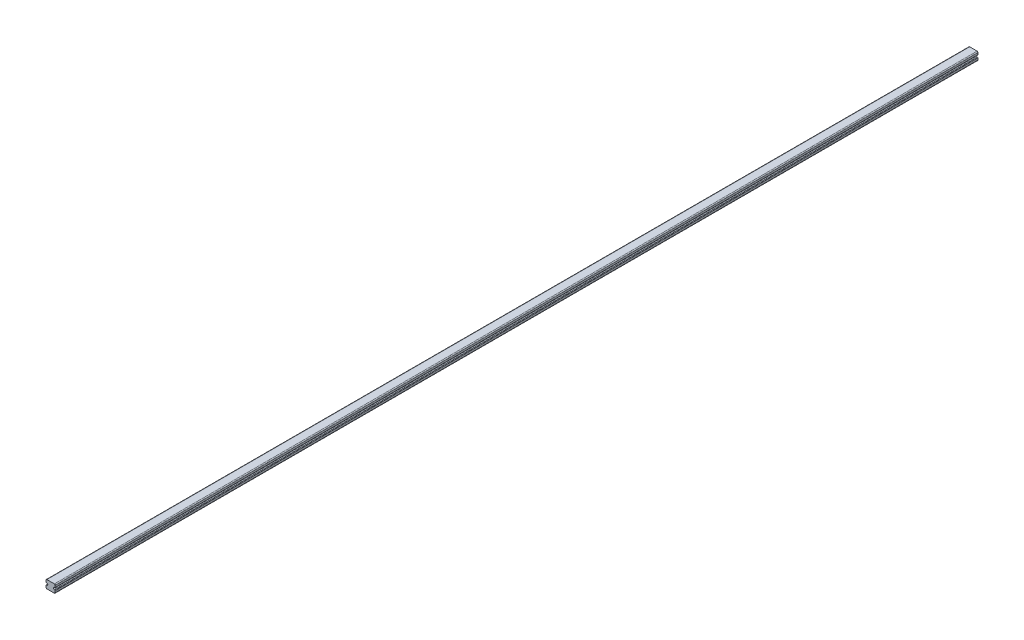
ISO-10303-21;
HEADER;
FILE_DESCRIPTION(('STEP AP214'),'2;1');
FILE_NAME('part.step','',(''),(''),'','','');
FILE_SCHEMA(('AUTOMOTIVE_DESIGN { 1 0 10303 214 1 1 1 1 }'));
ENDSEC;
DATA;
#1=APPLICATION_CONTEXT('core data for automotive mechanical design processes');
#2=APPLICATION_PROTOCOL_DEFINITION('international standard','automotive_design',2000,#1);
#3=PRODUCT_CONTEXT('',#1,'mechanical');
#4=PRODUCT('Part','Part','',(#3));
#5=PRODUCT_RELATED_PRODUCT_CATEGORY('part','',(#4));
#6=PRODUCT_DEFINITION_FORMATION('','',#4);
#7=PRODUCT_DEFINITION_CONTEXT('part definition',#1,'design');
#8=PRODUCT_DEFINITION('design','',#6,#7);
#9=PRODUCT_DEFINITION_SHAPE('','',#8);
#10=(LENGTH_UNIT() NAMED_UNIT(*) SI_UNIT(.MILLI.,.METRE.));
#11=(NAMED_UNIT(*) PLANE_ANGLE_UNIT() SI_UNIT($,.RADIAN.));
#12=(NAMED_UNIT(*) SI_UNIT($,.STERADIAN.) SOLID_ANGLE_UNIT());
#13=UNCERTAINTY_MEASURE_WITH_UNIT(LENGTH_MEASURE(1.E-05),#10,'distance_accuracy_value','');
#14=(GEOMETRIC_REPRESENTATION_CONTEXT(3) GLOBAL_UNCERTAINTY_ASSIGNED_CONTEXT((#13)) GLOBAL_UNIT_ASSIGNED_CONTEXT((#10,
#11,#12)) REPRESENTATION_CONTEXT('',''));
#15=CARTESIAN_POINT('',(0.,0.,0.));
#16=DIRECTION('',(0.,0.,1.));
#17=DIRECTION('',(1.,0.,0.));
#18=AXIS2_PLACEMENT_3D('',#15,#16,#17);
#19=CARTESIAN_POINT('',(-8.,-6.75,2000.));
#20=DIRECTION('',(0.,0.,-1.));
#21=DIRECTION('',(-1.,0.,0.));
#22=AXIS2_PLACEMENT_3D('',#19,#20,#21);
#23=CYLINDRICAL_SURFACE('',#22,2.);
#24=CARTESIAN_POINT('',(-8.,-6.75,0.));
#25=DIRECTION('',(0.,0.,1.));
#26=DIRECTION('',(-1.,0.,0.));
#27=AXIS2_PLACEMENT_3D('',#24,#25,#26);
#28=CIRCLE('',#27,2.);
#29=CARTESIAN_POINT('',(-10.,-6.74999999999999,0.));
#30=VERTEX_POINT('',#29);
#31=CARTESIAN_POINT('',(-7.99999999999999,-8.75,0.));
#32=VERTEX_POINT('',#31);
#33=EDGE_CURVE('E208',#30,#32,#28,.T.);
#34=ORIENTED_EDGE('',*,*,#33,.T.);
#35=DIRECTION('',(0.,0.,-1.));
#36=VECTOR('',#35,1.);
#37=CARTESIAN_POINT('',(-7.99999999999999,-8.75,2000.));
#38=LINE('',#37,#36);
#39=CARTESIAN_POINT('',(-7.99999999999999,-8.75,2000.));
#40=VERTEX_POINT('',#39);
#41=EDGE_CURVE('E11',#40,#32,#38,.T.);
#42=ORIENTED_EDGE('',*,*,#41,.F.);
#43=CARTESIAN_POINT('',(-8.,-6.75,2000.));
#44=DIRECTION('',(0.,0.,1.));
#45=DIRECTION('',(-1.,0.,0.));
#46=AXIS2_PLACEMENT_3D('',#43,#44,#45);
#47=CIRCLE('',#46,2.);
#48=CARTESIAN_POINT('',(-10.,-6.74999999999999,2000.));
#49=VERTEX_POINT('',#48);
#50=EDGE_CURVE('E246',#49,#40,#47,.T.);
#51=ORIENTED_EDGE('',*,*,#50,.F.);
#52=DIRECTION('',(0.,0.,-1.));
#53=VECTOR('',#52,1.);
#54=CARTESIAN_POINT('',(-10.,-6.74999999999999,2000.));
#55=LINE('',#54,#53);
#56=EDGE_CURVE('E204',#49,#30,#55,.T.);
#57=ORIENTED_EDGE('',*,*,#56,.T.);
#58=EDGE_LOOP('',(#34,#42,#51,#57));
#59=FACE_BOUND('',#58,.T.);
#60=ADVANCED_FACE('F40',(#59),#23,.T.);
#61=CARTESIAN_POINT('',(-7.99999999999999,-8.75,2000.));
#62=DIRECTION('',(0.,1.,0.));
#63=DIRECTION('',(0.,0.,1.));
#64=AXIS2_PLACEMENT_3D('',#61,#62,#63);
#65=PLANE('',#64);
#66=DIRECTION('',(1.,0.,0.));
#67=VECTOR('',#66,1.);
#68=CARTESIAN_POINT('',(-7.99999999999999,-8.75,0.));
#69=LINE('',#68,#67);
#70=CARTESIAN_POINT('',(7.99999999999998,-8.75,0.));
#71=VERTEX_POINT('',#70);
#72=EDGE_CURVE('E211',#32,#71,#69,.T.);
#73=ORIENTED_EDGE('',*,*,#72,.T.);
#74=DIRECTION('',(0.,0.,-1.));
#75=VECTOR('',#74,1.);
#76=CARTESIAN_POINT('',(7.99999999999998,-8.75,2000.));
#77=LINE('',#76,#75);
#78=CARTESIAN_POINT('',(7.99999999999998,-8.75,2000.));
#79=VERTEX_POINT('',#78);
#80=EDGE_CURVE('E48',#79,#71,#77,.T.);
#81=ORIENTED_EDGE('',*,*,#80,.F.);
#82=DIRECTION('',(1.,0.,0.));
#83=VECTOR('',#82,1.);
#84=CARTESIAN_POINT('',(-7.99999999999999,-8.75,2000.));
#85=LINE('',#84,#83);
#86=EDGE_CURVE('E135',#40,#79,#85,.T.);
#87=ORIENTED_EDGE('',*,*,#86,.F.);
#88=ORIENTED_EDGE('',*,*,#41,.T.);
#89=EDGE_LOOP('',(#73,#81,#87,#88));
#90=FACE_BOUND('',#89,.T.);
#91=ADVANCED_FACE('F364',(#90),#65,.F.);
#92=CARTESIAN_POINT('',(8.,-6.75,2000.));
#93=DIRECTION('',(0.,0.,-1.));
#94=DIRECTION('',(-1.,0.,0.));
#95=AXIS2_PLACEMENT_3D('',#92,#93,#94);
#96=CYLINDRICAL_SURFACE('',#95,2.);
#97=CARTESIAN_POINT('',(8.,-6.75,0.));
#98=DIRECTION('',(0.,0.,1.));
#99=DIRECTION('',(-1.,0.,0.));
#100=AXIS2_PLACEMENT_3D('',#97,#98,#99);
#101=CIRCLE('',#100,2.);
#102=CARTESIAN_POINT('',(10.,-6.74999999999999,0.));
#103=VERTEX_POINT('',#102);
#104=EDGE_CURVE('E213',#71,#103,#101,.T.);
#105=ORIENTED_EDGE('',*,*,#104,.T.);
#106=DIRECTION('',(0.,0.,-1.));
#107=VECTOR('',#106,1.);
#108=CARTESIAN_POINT('',(10.,-6.74999999999999,2000.));
#109=LINE('',#108,#107);
#110=CARTESIAN_POINT('',(10.,-6.74999999999999,2000.));
#111=VERTEX_POINT('',#110);
#112=EDGE_CURVE('E289',#111,#103,#109,.T.);
#113=ORIENTED_EDGE('',*,*,#112,.F.);
#114=CARTESIAN_POINT('',(8.,-6.75,2000.));
#115=DIRECTION('',(0.,0.,1.));
#116=DIRECTION('',(-1.,0.,0.));
#117=AXIS2_PLACEMENT_3D('',#114,#115,#116);
#118=CIRCLE('',#117,2.);
#119=EDGE_CURVE('E297',#79,#111,#118,.T.);
#120=ORIENTED_EDGE('',*,*,#119,.F.);
#121=ORIENTED_EDGE('',*,*,#80,.T.);
#122=EDGE_LOOP('',(#105,#113,#120,#121));
#123=FACE_BOUND('',#122,.T.);
#124=ADVANCED_FACE('F295',(#123),#96,.T.);
#125=CARTESIAN_POINT('',(10.,-6.74999999999999,2000.));
#126=DIRECTION('',(-1.,0.,0.));
#127=DIRECTION('',(0.,0.,1.));
#128=AXIS2_PLACEMENT_3D('',#125,#126,#127);
#129=PLANE('',#128);
#130=DIRECTION('',(0.,1.,0.));
#131=VECTOR('',#130,1.);
#132=CARTESIAN_POINT('',(10.,-6.74999999999999,0.));
#133=LINE('',#132,#131);
#134=CARTESIAN_POINT('',(10.,-3.00000000000001,0.));
#135=VERTEX_POINT('',#134);
#136=EDGE_CURVE('E215',#103,#135,#133,.T.);
#137=ORIENTED_EDGE('',*,*,#136,.T.);
#138=DIRECTION('',(0.,0.,-1.));
#139=VECTOR('',#138,1.);
#140=CARTESIAN_POINT('',(10.,-3.00000000000001,2000.));
#141=LINE('',#140,#139);
#142=CARTESIAN_POINT('',(10.,-3.00000000000001,2000.));
#143=VERTEX_POINT('',#142);
#144=EDGE_CURVE('E286',#143,#135,#141,.T.);
#145=ORIENTED_EDGE('',*,*,#144,.F.);
#146=DIRECTION('',(0.,1.,0.));
#147=VECTOR('',#146,1.);
#148=CARTESIAN_POINT('',(10.,-6.74999999999999,2000.));
#149=LINE('',#148,#147);
#150=EDGE_CURVE('E315',#111,#143,#149,.T.);
#151=ORIENTED_EDGE('',*,*,#150,.F.);
#152=ORIENTED_EDGE('',*,*,#112,.T.);
#153=EDGE_LOOP('',(#137,#145,#151,#152));
#154=FACE_BOUND('',#153,.T.);
#155=ADVANCED_FACE('F306',(#154),#129,.F.);
#156=CARTESIAN_POINT('',(9.,-3.,2000.));
#157=DIRECTION('',(0.,0.,-1.));
#158=DIRECTION('',(-1.,0.,0.));
#159=AXIS2_PLACEMENT_3D('',#156,#157,#158);
#160=CYLINDRICAL_SURFACE('',#159,1.);
#161=CARTESIAN_POINT('',(9.,-3.,0.));
#162=DIRECTION('',(0.,0.,1.));
#163=DIRECTION('',(1.,0.,0.));
#164=AXIS2_PLACEMENT_3D('',#161,#162,#163);
#165=CIRCLE('',#164,1.);
#166=CARTESIAN_POINT('',(8.99999999999999,-2.,0.));
#167=VERTEX_POINT('',#166);
#168=EDGE_CURVE('E217',#135,#167,#165,.T.);
#169=ORIENTED_EDGE('',*,*,#168,.T.);
#170=DIRECTION('',(0.,0.,-1.));
#171=VECTOR('',#170,1.);
#172=CARTESIAN_POINT('',(8.99999999999999,-2.,2000.));
#173=LINE('',#172,#171);
#174=CARTESIAN_POINT('',(8.99999999999999,-2.,2000.));
#175=VERTEX_POINT('',#174);
#176=EDGE_CURVE('E283',#175,#167,#173,.T.);
#177=ORIENTED_EDGE('',*,*,#176,.F.);
#178=CARTESIAN_POINT('',(9.,-3.,2000.));
#179=DIRECTION('',(0.,0.,1.));
#180=DIRECTION('',(1.,0.,0.));
#181=AXIS2_PLACEMENT_3D('',#178,#179,#180);
#182=CIRCLE('',#181,1.);
#183=EDGE_CURVE('E312',#143,#175,#182,.T.);
#184=ORIENTED_EDGE('',*,*,#183,.F.);
#185=ORIENTED_EDGE('',*,*,#144,.T.);
#186=EDGE_LOOP('',(#169,#177,#184,#185));
#187=FACE_BOUND('',#186,.T.);
#188=ADVANCED_FACE('F310',(#187),#160,.T.);
#189=CARTESIAN_POINT('',(8.,-2.,2000.));
#190=DIRECTION('',(0.,-1.,0.));
#191=DIRECTION('',(0.,0.,-1.));
#192=AXIS2_PLACEMENT_3D('',#189,#190,#191);
#193=PLANE('',#192);
#194=DIRECTION('',(-1.,0.,0.));
#195=VECTOR('',#194,1.);
#196=CARTESIAN_POINT('',(8.,-2.,0.));
#197=LINE('',#196,#195);
#198=CARTESIAN_POINT('',(8.,-2.,0.));
#199=VERTEX_POINT('',#198);
#200=EDGE_CURVE('E219',#167,#199,#197,.T.);
#201=ORIENTED_EDGE('',*,*,#200,.T.);
#202=DIRECTION('',(0.,0.,-1.));
#203=VECTOR('',#202,1.);
#204=CARTESIAN_POINT('',(8.,-2.,2000.));
#205=LINE('',#204,#203);
#206=CARTESIAN_POINT('',(8.,-2.,2000.));
#207=VERTEX_POINT('',#206);
#208=EDGE_CURVE('E280',#207,#199,#205,.T.);
#209=ORIENTED_EDGE('',*,*,#208,.F.);
#210=DIRECTION('',(-1.,0.,0.));
#211=VECTOR('',#210,1.);
#212=CARTESIAN_POINT('',(8.,-2.,2000.));
#213=LINE('',#212,#211);
#214=EDGE_CURVE('E314',#175,#207,#213,.T.);
#215=ORIENTED_EDGE('',*,*,#214,.F.);
#216=ORIENTED_EDGE('',*,*,#176,.T.);
#217=EDGE_LOOP('',(#201,#209,#215,#216));
#218=FACE_BOUND('',#217,.T.);
#219=ADVANCED_FACE('F377',(#218),#193,.F.);
#220=CARTESIAN_POINT('',(8.,0.,2000.));
#221=DIRECTION('',(0.,0.,-1.));
#222=DIRECTION('',(-1.,0.,0.));
#223=AXIS2_PLACEMENT_3D('',#220,#221,#222);
#224=CYLINDRICAL_SURFACE('',#223,2.);
#225=CARTESIAN_POINT('',(8.,0.,0.));
#226=DIRECTION('',(0.,0.,-1.));
#227=DIRECTION('',(-1.,0.,0.));
#228=AXIS2_PLACEMENT_3D('',#225,#226,#227);
#229=CIRCLE('',#228,2.);
#230=CARTESIAN_POINT('',(8.,2.,0.));
#231=VERTEX_POINT('',#230);
#232=EDGE_CURVE('E221',#199,#231,#229,.T.);
#233=ORIENTED_EDGE('',*,*,#232,.T.);
#234=DIRECTION('',(0.,0.,-1.));
#235=VECTOR('',#234,1.);
#236=CARTESIAN_POINT('',(8.,2.,2000.));
#237=LINE('',#236,#235);
#238=CARTESIAN_POINT('',(8.,2.,2000.));
#239=VERTEX_POINT('',#238);
#240=EDGE_CURVE('E277',#239,#231,#237,.T.);
#241=ORIENTED_EDGE('',*,*,#240,.F.);
#242=CARTESIAN_POINT('',(8.,0.,2000.));
#243=DIRECTION('',(0.,0.,-1.));
#244=DIRECTION('',(-1.,0.,0.));
#245=AXIS2_PLACEMENT_3D('',#242,#243,#244);
#246=CIRCLE('',#245,2.);
#247=EDGE_CURVE('E317',#207,#239,#246,.T.);
#248=ORIENTED_EDGE('',*,*,#247,.F.);
#249=ORIENTED_EDGE('',*,*,#208,.T.);
#250=EDGE_LOOP('',(#233,#241,#248,#249));
#251=FACE_BOUND('',#250,.T.);
#252=ADVANCED_FACE('F380',(#251),#224,.F.);
#253=CARTESIAN_POINT('',(8.,2.,2000.));
#254=DIRECTION('',(0.,1.,0.));
#255=DIRECTION('',(0.,0.,1.));
#256=AXIS2_PLACEMENT_3D('',#253,#254,#255);
#257=PLANE('',#256);
#258=DIRECTION('',(1.,0.,0.));
#259=VECTOR('',#258,1.);
#260=CARTESIAN_POINT('',(8.,2.,0.));
#261=LINE('',#260,#259);
#262=CARTESIAN_POINT('',(8.99999999999999,2.,0.));
#263=VERTEX_POINT('',#262);
#264=EDGE_CURVE('E223',#231,#263,#261,.T.);
#265=ORIENTED_EDGE('',*,*,#264,.T.);
#266=DIRECTION('',(0.,0.,-1.));
#267=VECTOR('',#266,1.);
#268=CARTESIAN_POINT('',(8.99999999999999,2.,2000.));
#269=LINE('',#268,#267);
#270=CARTESIAN_POINT('',(8.99999999999999,2.,2000.));
#271=VERTEX_POINT('',#270);
#272=EDGE_CURVE('E274',#271,#263,#269,.T.);
#273=ORIENTED_EDGE('',*,*,#272,.F.);
#274=DIRECTION('',(1.,0.,0.));
#275=VECTOR('',#274,1.);
#276=CARTESIAN_POINT('',(8.,2.,2000.));
#277=LINE('',#276,#275);
#278=EDGE_CURVE('E323',#239,#271,#277,.T.);
#279=ORIENTED_EDGE('',*,*,#278,.F.);
#280=ORIENTED_EDGE('',*,*,#240,.T.);
#281=EDGE_LOOP('',(#265,#273,#279,#280));
#282=FACE_BOUND('',#281,.T.);
#283=ADVANCED_FACE('F384',(#282),#257,.F.);
#284=CARTESIAN_POINT('',(9.,3.,2000.));
#285=DIRECTION('',(0.,0.,-1.));
#286=DIRECTION('',(-1.,0.,0.));
#287=AXIS2_PLACEMENT_3D('',#284,#285,#286);
#288=CYLINDRICAL_SURFACE('',#287,1.);
#289=CARTESIAN_POINT('',(9.,3.,0.));
#290=DIRECTION('',(0.,0.,1.));
#291=DIRECTION('',(1.,0.,0.));
#292=AXIS2_PLACEMENT_3D('',#289,#290,#291);
#293=CIRCLE('',#292,1.);
#294=CARTESIAN_POINT('',(10.,3.,0.));
#295=VERTEX_POINT('',#294);
#296=EDGE_CURVE('E225',#263,#295,#293,.T.);
#297=ORIENTED_EDGE('',*,*,#296,.T.);
#298=DIRECTION('',(0.,0.,-1.));
#299=VECTOR('',#298,1.);
#300=CARTESIAN_POINT('',(10.,3.,2000.));
#301=LINE('',#300,#299);
#302=CARTESIAN_POINT('',(10.,3.,2000.));
#303=VERTEX_POINT('',#302);
#304=EDGE_CURVE('E271',#303,#295,#301,.T.);
#305=ORIENTED_EDGE('',*,*,#304,.F.);
#306=CARTESIAN_POINT('',(9.,3.,2000.));
#307=DIRECTION('',(0.,0.,1.));
#308=DIRECTION('',(1.,0.,0.));
#309=AXIS2_PLACEMENT_3D('',#306,#307,#308);
#310=CIRCLE('',#309,1.);
#311=EDGE_CURVE('E325',#271,#303,#310,.T.);
#312=ORIENTED_EDGE('',*,*,#311,.F.);
#313=ORIENTED_EDGE('',*,*,#272,.T.);
#314=EDGE_LOOP('',(#297,#305,#312,#313));
#315=FACE_BOUND('',#314,.T.);
#316=ADVANCED_FACE('F388',(#315),#288,.T.);
#317=CARTESIAN_POINT('',(10.,3.00000000000001,2000.));
#318=DIRECTION('',(-1.,0.,0.));
#319=DIRECTION('',(0.,0.,1.));
#320=AXIS2_PLACEMENT_3D('',#317,#318,#319);
#321=PLANE('',#320);
#322=DIRECTION('',(0.,1.,0.));
#323=VECTOR('',#322,1.);
#324=CARTESIAN_POINT('',(10.,3.00000000000001,0.));
#325=LINE('',#324,#323);
#326=CARTESIAN_POINT('',(10.,6.74999999999999,0.));
#327=VERTEX_POINT('',#326);
#328=EDGE_CURVE('E227',#295,#327,#325,.T.);
#329=ORIENTED_EDGE('',*,*,#328,.T.);
#330=DIRECTION('',(0.,0.,-1.));
#331=VECTOR('',#330,1.);
#332=CARTESIAN_POINT('',(10.,6.74999999999999,2000.));
#333=LINE('',#332,#331);
#334=CARTESIAN_POINT('',(10.,6.74999999999999,2000.));
#335=VERTEX_POINT('',#334);
#336=EDGE_CURVE('E268',#335,#327,#333,.T.);
#337=ORIENTED_EDGE('',*,*,#336,.F.);
#338=DIRECTION('',(0.,1.,0.));
#339=VECTOR('',#338,1.);
#340=CARTESIAN_POINT('',(10.,3.00000000000001,2000.));
#341=LINE('',#340,#339);
#342=EDGE_CURVE('E327',#303,#335,#341,.T.);
#343=ORIENTED_EDGE('',*,*,#342,.F.);
#344=ORIENTED_EDGE('',*,*,#304,.T.);
#345=EDGE_LOOP('',(#329,#337,#343,#344));
#346=FACE_BOUND('',#345,.T.);
#347=ADVANCED_FACE('F392',(#346),#321,.F.);
#348=CARTESIAN_POINT('',(8.,6.75,2000.));
#349=DIRECTION('',(0.,0.,-1.));
#350=DIRECTION('',(-1.,0.,0.));
#351=AXIS2_PLACEMENT_3D('',#348,#349,#350);
#352=CYLINDRICAL_SURFACE('',#351,2.);
#353=CARTESIAN_POINT('',(8.,6.75,0.));
#354=DIRECTION('',(0.,0.,1.));
#355=DIRECTION('',(1.,0.,0.));
#356=AXIS2_PLACEMENT_3D('',#353,#354,#355);
#357=CIRCLE('',#356,2.);
#358=CARTESIAN_POINT('',(7.99999999999998,8.75,0.));
#359=VERTEX_POINT('',#358);
#360=EDGE_CURVE('E229',#327,#359,#357,.T.);
#361=ORIENTED_EDGE('',*,*,#360,.T.);
#362=DIRECTION('',(0.,0.,-1.));
#363=VECTOR('',#362,1.);
#364=CARTESIAN_POINT('',(7.99999999999998,8.75,2000.));
#365=LINE('',#364,#363);
#366=CARTESIAN_POINT('',(7.99999999999998,8.75,2000.));
#367=VERTEX_POINT('',#366);
#368=EDGE_CURVE('E265',#367,#359,#365,.T.);
#369=ORIENTED_EDGE('',*,*,#368,.F.);
#370=CARTESIAN_POINT('',(8.,6.75,2000.));
#371=DIRECTION('',(0.,0.,1.));
#372=DIRECTION('',(1.,0.,0.));
#373=AXIS2_PLACEMENT_3D('',#370,#371,#372);
#374=CIRCLE('',#373,2.);
#375=EDGE_CURVE('E329',#335,#367,#374,.T.);
#376=ORIENTED_EDGE('',*,*,#375,.F.);
#377=ORIENTED_EDGE('',*,*,#336,.T.);
#378=EDGE_LOOP('',(#361,#369,#376,#377));
#379=FACE_BOUND('',#378,.T.);
#380=ADVANCED_FACE('F396',(#379),#352,.T.);
#381=CARTESIAN_POINT('',(-7.99999999999999,8.75,2000.));
#382=DIRECTION('',(0.,-1.,0.));
#383=DIRECTION('',(0.,0.,-1.));
#384=AXIS2_PLACEMENT_3D('',#381,#382,#383);
#385=PLANE('',#384);
#386=DIRECTION('',(-1.,0.,0.));
#387=VECTOR('',#386,1.);
#388=CARTESIAN_POINT('',(-7.99999999999999,8.75,0.));
#389=LINE('',#388,#387);
#390=CARTESIAN_POINT('',(-7.99999999999999,8.75,0.));
#391=VERTEX_POINT('',#390);
#392=EDGE_CURVE('E231',#359,#391,#389,.T.);
#393=ORIENTED_EDGE('',*,*,#392,.T.);
#394=DIRECTION('',(0.,0.,-1.));
#395=VECTOR('',#394,1.);
#396=CARTESIAN_POINT('',(-7.99999999999999,8.75,2000.));
#397=LINE('',#396,#395);
#398=CARTESIAN_POINT('',(-7.99999999999999,8.75,2000.));
#399=VERTEX_POINT('',#398);
#400=EDGE_CURVE('E262',#399,#391,#397,.T.);
#401=ORIENTED_EDGE('',*,*,#400,.F.);
#402=DIRECTION('',(-1.,0.,0.));
#403=VECTOR('',#402,1.);
#404=CARTESIAN_POINT('',(-7.99999999999999,8.75,2000.));
#405=LINE('',#404,#403);
#406=EDGE_CURVE('E331',#367,#399,#405,.T.);
#407=ORIENTED_EDGE('',*,*,#406,.F.);
#408=ORIENTED_EDGE('',*,*,#368,.T.);
#409=EDGE_LOOP('',(#393,#401,#407,#408));
#410=FACE_BOUND('',#409,.T.);
#411=ADVANCED_FACE('F400',(#410),#385,.F.);
#412=CARTESIAN_POINT('',(-8.,6.75,2000.));
#413=DIRECTION('',(0.,0.,-1.));
#414=DIRECTION('',(-1.,0.,0.));
#415=AXIS2_PLACEMENT_3D('',#412,#413,#414);
#416=CYLINDRICAL_SURFACE('',#415,2.);
#417=CARTESIAN_POINT('',(-8.,6.75,0.));
#418=DIRECTION('',(0.,0.,1.));
#419=DIRECTION('',(1.,0.,0.));
#420=AXIS2_PLACEMENT_3D('',#417,#418,#419);
#421=CIRCLE('',#420,2.);
#422=CARTESIAN_POINT('',(-10.,6.74999999999999,0.));
#423=VERTEX_POINT('',#422);
#424=EDGE_CURVE('E233',#391,#423,#421,.T.);
#425=ORIENTED_EDGE('',*,*,#424,.T.);
#426=DIRECTION('',(0.,0.,-1.));
#427=VECTOR('',#426,1.);
#428=CARTESIAN_POINT('',(-10.,6.74999999999999,2000.));
#429=LINE('',#428,#427);
#430=CARTESIAN_POINT('',(-10.,6.74999999999999,2000.));
#431=VERTEX_POINT('',#430);
#432=EDGE_CURVE('E259',#431,#423,#429,.T.);
#433=ORIENTED_EDGE('',*,*,#432,.F.);
#434=CARTESIAN_POINT('',(-8.,6.75,2000.));
#435=DIRECTION('',(0.,0.,1.));
#436=DIRECTION('',(1.,0.,0.));
#437=AXIS2_PLACEMENT_3D('',#434,#435,#436);
#438=CIRCLE('',#437,2.);
#439=EDGE_CURVE('E333',#399,#431,#438,.T.);
#440=ORIENTED_EDGE('',*,*,#439,.F.);
#441=ORIENTED_EDGE('',*,*,#400,.T.);
#442=EDGE_LOOP('',(#425,#433,#440,#441));
#443=FACE_BOUND('',#442,.T.);
#444=ADVANCED_FACE('F404',(#443),#416,.T.);
#445=CARTESIAN_POINT('',(-10.,3.00000000000001,2000.));
#446=DIRECTION('',(1.,0.,0.));
#447=DIRECTION('',(0.,0.,-1.));
#448=AXIS2_PLACEMENT_3D('',#445,#446,#447);
#449=PLANE('',#448);
#450=DIRECTION('',(0.,-1.,0.));
#451=VECTOR('',#450,1.);
#452=CARTESIAN_POINT('',(-10.,3.00000000000001,0.));
#453=LINE('',#452,#451);
#454=CARTESIAN_POINT('',(-10.,3.00000000000001,0.));
#455=VERTEX_POINT('',#454);
#456=EDGE_CURVE('E235',#423,#455,#453,.T.);
#457=ORIENTED_EDGE('',*,*,#456,.T.);
#458=DIRECTION('',(0.,0.,-1.));
#459=VECTOR('',#458,1.);
#460=CARTESIAN_POINT('',(-10.,3.00000000000001,2000.));
#461=LINE('',#460,#459);
#462=CARTESIAN_POINT('',(-10.,3.00000000000001,2000.));
#463=VERTEX_POINT('',#462);
#464=EDGE_CURVE('E256',#463,#455,#461,.T.);
#465=ORIENTED_EDGE('',*,*,#464,.F.);
#466=DIRECTION('',(0.,-1.,0.));
#467=VECTOR('',#466,1.);
#468=CARTESIAN_POINT('',(-10.,3.00000000000001,2000.));
#469=LINE('',#468,#467);
#470=EDGE_CURVE('E335',#431,#463,#469,.T.);
#471=ORIENTED_EDGE('',*,*,#470,.F.);
#472=ORIENTED_EDGE('',*,*,#432,.T.);
#473=EDGE_LOOP('',(#457,#465,#471,#472));
#474=FACE_BOUND('',#473,.T.);
#475=ADVANCED_FACE('F408',(#474),#449,.F.);
#476=CARTESIAN_POINT('',(-9.,3.,2000.));
#477=DIRECTION('',(0.,0.,-1.));
#478=DIRECTION('',(-1.,0.,0.));
#479=AXIS2_PLACEMENT_3D('',#476,#477,#478);
#480=CYLINDRICAL_SURFACE('',#479,1.);
#481=CARTESIAN_POINT('',(-9.,3.,0.));
#482=DIRECTION('',(0.,0.,1.));
#483=DIRECTION('',(-1.,0.,0.));
#484=AXIS2_PLACEMENT_3D('',#481,#482,#483);
#485=CIRCLE('',#484,1.);
#486=CARTESIAN_POINT('',(-8.99999999999999,2.,0.));
#487=VERTEX_POINT('',#486);
#488=EDGE_CURVE('E237',#455,#487,#485,.T.);
#489=ORIENTED_EDGE('',*,*,#488,.T.);
#490=DIRECTION('',(0.,0.,-1.));
#491=VECTOR('',#490,1.);
#492=CARTESIAN_POINT('',(-8.99999999999999,2.,2000.));
#493=LINE('',#492,#491);
#494=CARTESIAN_POINT('',(-8.99999999999999,2.,2000.));
#495=VERTEX_POINT('',#494);
#496=EDGE_CURVE('E253',#495,#487,#493,.T.);
#497=ORIENTED_EDGE('',*,*,#496,.F.);
#498=CARTESIAN_POINT('',(-9.,3.,2000.));
#499=DIRECTION('',(0.,0.,1.));
#500=DIRECTION('',(-1.,0.,0.));
#501=AXIS2_PLACEMENT_3D('',#498,#499,#500);
#502=CIRCLE('',#501,1.);
#503=EDGE_CURVE('E337',#463,#495,#502,.T.);
#504=ORIENTED_EDGE('',*,*,#503,.F.);
#505=ORIENTED_EDGE('',*,*,#464,.T.);
#506=EDGE_LOOP('',(#489,#497,#504,#505));
#507=FACE_BOUND('',#506,.T.);
#508=ADVANCED_FACE('F412',(#507),#480,.T.);
#509=CARTESIAN_POINT('',(-8.,2.,2000.));
#510=DIRECTION('',(0.,1.,0.));
#511=DIRECTION('',(0.,0.,1.));
#512=AXIS2_PLACEMENT_3D('',#509,#510,#511);
#513=PLANE('',#512);
#514=DIRECTION('',(1.,0.,0.));
#515=VECTOR('',#514,1.);
#516=CARTESIAN_POINT('',(-8.,2.,0.));
#517=LINE('',#516,#515);
#518=CARTESIAN_POINT('',(-8.,2.,0.));
#519=VERTEX_POINT('',#518);
#520=EDGE_CURVE('E239',#487,#519,#517,.T.);
#521=ORIENTED_EDGE('',*,*,#520,.T.);
#522=DIRECTION('',(0.,0.,-1.));
#523=VECTOR('',#522,1.);
#524=CARTESIAN_POINT('',(-8.,2.,2000.));
#525=LINE('',#524,#523);
#526=CARTESIAN_POINT('',(-8.,2.,2000.));
#527=VERTEX_POINT('',#526);
#528=EDGE_CURVE('E250',#527,#519,#525,.T.);
#529=ORIENTED_EDGE('',*,*,#528,.F.);
#530=DIRECTION('',(1.,0.,0.));
#531=VECTOR('',#530,1.);
#532=CARTESIAN_POINT('',(-8.,2.,2000.));
#533=LINE('',#532,#531);
#534=EDGE_CURVE('E339',#495,#527,#533,.T.);
#535=ORIENTED_EDGE('',*,*,#534,.F.);
#536=ORIENTED_EDGE('',*,*,#496,.T.);
#537=EDGE_LOOP('',(#521,#529,#535,#536));
#538=FACE_BOUND('',#537,.T.);
#539=ADVANCED_FACE('F345',(#538),#513,.F.);
#540=CARTESIAN_POINT('',(-8.,0.,2000.));
#541=DIRECTION('',(0.,0.,-1.));
#542=DIRECTION('',(-1.,0.,0.));
#543=AXIS2_PLACEMENT_3D('',#540,#541,#542);
#544=CYLINDRICAL_SURFACE('',#543,2.);
#545=CARTESIAN_POINT('',(-8.,0.,0.));
#546=DIRECTION('',(0.,0.,-1.));
#547=DIRECTION('',(1.,0.,0.));
#548=AXIS2_PLACEMENT_3D('',#545,#546,#547);
#549=CIRCLE('',#548,2.);
#550=CARTESIAN_POINT('',(-8.,-2.,0.));
#551=VERTEX_POINT('',#550);
#552=EDGE_CURVE('E241',#519,#551,#549,.T.);
#553=ORIENTED_EDGE('',*,*,#552,.T.);
#554=DIRECTION('',(0.,0.,-1.));
#555=VECTOR('',#554,1.);
#556=CARTESIAN_POINT('',(-8.,-2.,2000.));
#557=LINE('',#556,#555);
#558=CARTESIAN_POINT('',(-8.,-2.,2000.));
#559=VERTEX_POINT('',#558);
#560=EDGE_CURVE('E199',#559,#551,#557,.T.);
#561=ORIENTED_EDGE('',*,*,#560,.F.);
#562=CARTESIAN_POINT('',(-8.,0.,2000.));
#563=DIRECTION('',(0.,0.,-1.));
#564=DIRECTION('',(1.,0.,0.));
#565=AXIS2_PLACEMENT_3D('',#562,#563,#564);
#566=CIRCLE('',#565,2.);
#567=EDGE_CURVE('E190',#527,#559,#566,.T.);
#568=ORIENTED_EDGE('',*,*,#567,.F.);
#569=ORIENTED_EDGE('',*,*,#528,.T.);
#570=EDGE_LOOP('',(#553,#561,#568,#569));
#571=FACE_BOUND('',#570,.T.);
#572=ADVANCED_FACE('F349',(#571),#544,.F.);
#573=CARTESIAN_POINT('',(-8.,-2.,2000.));
#574=DIRECTION('',(0.,-1.,0.));
#575=DIRECTION('',(0.,0.,-1.));
#576=AXIS2_PLACEMENT_3D('',#573,#574,#575);
#577=PLANE('',#576);
#578=DIRECTION('',(-1.,0.,0.));
#579=VECTOR('',#578,1.);
#580=CARTESIAN_POINT('',(-8.,-2.,0.));
#581=LINE('',#580,#579);
#582=CARTESIAN_POINT('',(-8.99999999999999,-2.,0.));
#583=VERTEX_POINT('',#582);
#584=EDGE_CURVE('E198',#551,#583,#581,.T.);
#585=ORIENTED_EDGE('',*,*,#584,.T.);
#586=DIRECTION('',(0.,0.,-1.));
#587=VECTOR('',#586,1.);
#588=CARTESIAN_POINT('',(-8.99999999999999,-2.,2000.));
#589=LINE('',#588,#587);
#590=CARTESIAN_POINT('',(-8.99999999999999,-2.,2000.));
#591=VERTEX_POINT('',#590);
#592=EDGE_CURVE('E195',#591,#583,#589,.T.);
#593=ORIENTED_EDGE('',*,*,#592,.F.);
#594=DIRECTION('',(-1.,0.,0.));
#595=VECTOR('',#594,1.);
#596=CARTESIAN_POINT('',(-8.,-2.,2000.));
#597=LINE('',#596,#595);
#598=EDGE_CURVE('E184',#559,#591,#597,.T.);
#599=ORIENTED_EDGE('',*,*,#598,.F.);
#600=ORIENTED_EDGE('',*,*,#560,.T.);
#601=EDGE_LOOP('',(#585,#593,#599,#600));
#602=FACE_BOUND('',#601,.T.);
#603=ADVANCED_FACE('F196',(#602),#577,.F.);
#604=CARTESIAN_POINT('',(-9.,-3.,2000.));
#605=DIRECTION('',(0.,0.,-1.));
#606=DIRECTION('',(-1.,0.,0.));
#607=AXIS2_PLACEMENT_3D('',#604,#605,#606);
#608=CYLINDRICAL_SURFACE('',#607,1.);
#609=CARTESIAN_POINT('',(-9.,-3.,0.));
#610=DIRECTION('',(0.,0.,1.));
#611=DIRECTION('',(-1.,0.,0.));
#612=AXIS2_PLACEMENT_3D('',#609,#610,#611);
#613=CIRCLE('',#612,1.);
#614=CARTESIAN_POINT('',(-10.,-3.00000000000001,0.));
#615=VERTEX_POINT('',#614);
#616=EDGE_CURVE('E121',#583,#615,#613,.T.);
#617=ORIENTED_EDGE('',*,*,#616,.T.);
#618=DIRECTION('',(0.,0.,-1.));
#619=VECTOR('',#618,1.);
#620=CARTESIAN_POINT('',(-10.,-3.00000000000001,2000.));
#621=LINE('',#620,#619);
#622=CARTESIAN_POINT('',(-10.,-3.00000000000001,2000.));
#623=VERTEX_POINT('',#622);
#624=EDGE_CURVE('E200',#623,#615,#621,.T.);
#625=ORIENTED_EDGE('',*,*,#624,.F.);
#626=CARTESIAN_POINT('',(-9.,-3.,2000.));
#627=DIRECTION('',(0.,0.,1.));
#628=DIRECTION('',(-1.,0.,0.));
#629=AXIS2_PLACEMENT_3D('',#626,#627,#628);
#630=CIRCLE('',#629,1.);
#631=EDGE_CURVE('E188',#591,#623,#630,.T.);
#632=ORIENTED_EDGE('',*,*,#631,.F.);
#633=ORIENTED_EDGE('',*,*,#592,.T.);
#634=EDGE_LOOP('',(#617,#625,#632,#633));
#635=FACE_BOUND('',#634,.T.);
#636=ADVANCED_FACE('F202',(#635),#608,.T.);
#637=CARTESIAN_POINT('',(-10.,-6.74999999999999,2000.));
#638=DIRECTION('',(1.,0.,0.));
#639=DIRECTION('',(0.,0.,-1.));
#640=AXIS2_PLACEMENT_3D('',#637,#638,#639);
#641=PLANE('',#640);
#642=DIRECTION('',(0.,-1.,0.));
#643=VECTOR('',#642,1.);
#644=CARTESIAN_POINT('',(-10.,-6.74999999999999,0.));
#645=LINE('',#644,#643);
#646=EDGE_CURVE('E127',#615,#30,#645,.T.);
#647=ORIENTED_EDGE('',*,*,#646,.T.);
#648=ORIENTED_EDGE('',*,*,#56,.F.);
#649=DIRECTION('',(0.,-1.,0.));
#650=VECTOR('',#649,1.);
#651=CARTESIAN_POINT('',(-10.,-6.74999999999999,2000.));
#652=LINE('',#651,#650);
#653=EDGE_CURVE('E56',#623,#49,#652,.T.);
#654=ORIENTED_EDGE('',*,*,#653,.F.);
#655=ORIENTED_EDGE('',*,*,#624,.T.);
#656=EDGE_LOOP('',(#647,#648,#654,#655));
#657=FACE_BOUND('',#656,.T.);
#658=ADVANCED_FACE('F353',(#657),#641,.F.);
#659=CARTESIAN_POINT('',(-8.,-6.75,2000.));
#660=DIRECTION('',(0.,0.,-1.));
#661=DIRECTION('',(-1.,0.,0.));
#662=AXIS2_PLACEMENT_3D('',#659,#660,#661);
#663=PLANE('',#662);
#664=ORIENTED_EDGE('',*,*,#50,.T.);
#665=ORIENTED_EDGE('',*,*,#86,.T.);
#666=ORIENTED_EDGE('',*,*,#119,.T.);
#667=ORIENTED_EDGE('',*,*,#150,.T.);
#668=ORIENTED_EDGE('',*,*,#183,.T.);
#669=ORIENTED_EDGE('',*,*,#214,.T.);
#670=ORIENTED_EDGE('',*,*,#247,.T.);
#671=ORIENTED_EDGE('',*,*,#278,.T.);
#672=ORIENTED_EDGE('',*,*,#311,.T.);
#673=ORIENTED_EDGE('',*,*,#342,.T.);
#674=ORIENTED_EDGE('',*,*,#375,.T.);
#675=ORIENTED_EDGE('',*,*,#406,.T.);
#676=ORIENTED_EDGE('',*,*,#439,.T.);
#677=ORIENTED_EDGE('',*,*,#470,.T.);
#678=ORIENTED_EDGE('',*,*,#503,.T.);
#679=ORIENTED_EDGE('',*,*,#534,.T.);
#680=ORIENTED_EDGE('',*,*,#567,.T.);
#681=ORIENTED_EDGE('',*,*,#598,.T.);
#682=ORIENTED_EDGE('',*,*,#631,.T.);
#683=ORIENTED_EDGE('',*,*,#653,.T.);
#684=EDGE_LOOP('',(#664,#665,#666,#667,#668,#669,#670,#671,#672,#673,#674,#675,#676,#677,#678,
#679,#680,#681,#682,#683));
#685=FACE_BOUND('',#684,.T.);
#686=ADVANCED_FACE('F186',(#685),#663,.F.);
#687=CARTESIAN_POINT('',(-8.,-6.75,0.));
#688=DIRECTION('',(0.,0.,-1.));
#689=DIRECTION('',(-1.,0.,0.));
#690=AXIS2_PLACEMENT_3D('',#687,#688,#689);
#691=PLANE('',#690);
#692=ORIENTED_EDGE('',*,*,#33,.F.);
#693=ORIENTED_EDGE('',*,*,#646,.F.);
#694=ORIENTED_EDGE('',*,*,#616,.F.);
#695=ORIENTED_EDGE('',*,*,#584,.F.);
#696=ORIENTED_EDGE('',*,*,#552,.F.);
#697=ORIENTED_EDGE('',*,*,#520,.F.);
#698=ORIENTED_EDGE('',*,*,#488,.F.);
#699=ORIENTED_EDGE('',*,*,#456,.F.);
#700=ORIENTED_EDGE('',*,*,#424,.F.);
#701=ORIENTED_EDGE('',*,*,#392,.F.);
#702=ORIENTED_EDGE('',*,*,#360,.F.);
#703=ORIENTED_EDGE('',*,*,#328,.F.);
#704=ORIENTED_EDGE('',*,*,#296,.F.);
#705=ORIENTED_EDGE('',*,*,#264,.F.);
#706=ORIENTED_EDGE('',*,*,#232,.F.);
#707=ORIENTED_EDGE('',*,*,#200,.F.);
#708=ORIENTED_EDGE('',*,*,#168,.F.);
#709=ORIENTED_EDGE('',*,*,#136,.F.);
#710=ORIENTED_EDGE('',*,*,#104,.F.);
#711=ORIENTED_EDGE('',*,*,#72,.F.);
#712=EDGE_LOOP('',(#692,#693,#694,#695,#696,#697,#698,#699,#700,#701,#702,#703,#704,#705,#706,
#707,#708,#709,#710,#711));
#713=FACE_BOUND('',#712,.T.);
#714=ADVANCED_FACE('F301',(#713),#691,.T.);
#715=CLOSED_SHELL('',(#60,#91,#124,#155,#188,#219,#252,#283,#316,#347,#380,#411,#444,#475,#508,
#539,#572,#603,#636,#658,#686,#714));
#716=MANIFOLD_SOLID_BREP('B2',#715);
#717=ADVANCED_BREP_SHAPE_REPRESENTATION('',(#18,#716),#14);
#718=SHAPE_DEFINITION_REPRESENTATION(#9,#717);
ENDSEC;
END-ISO-10303-21;
